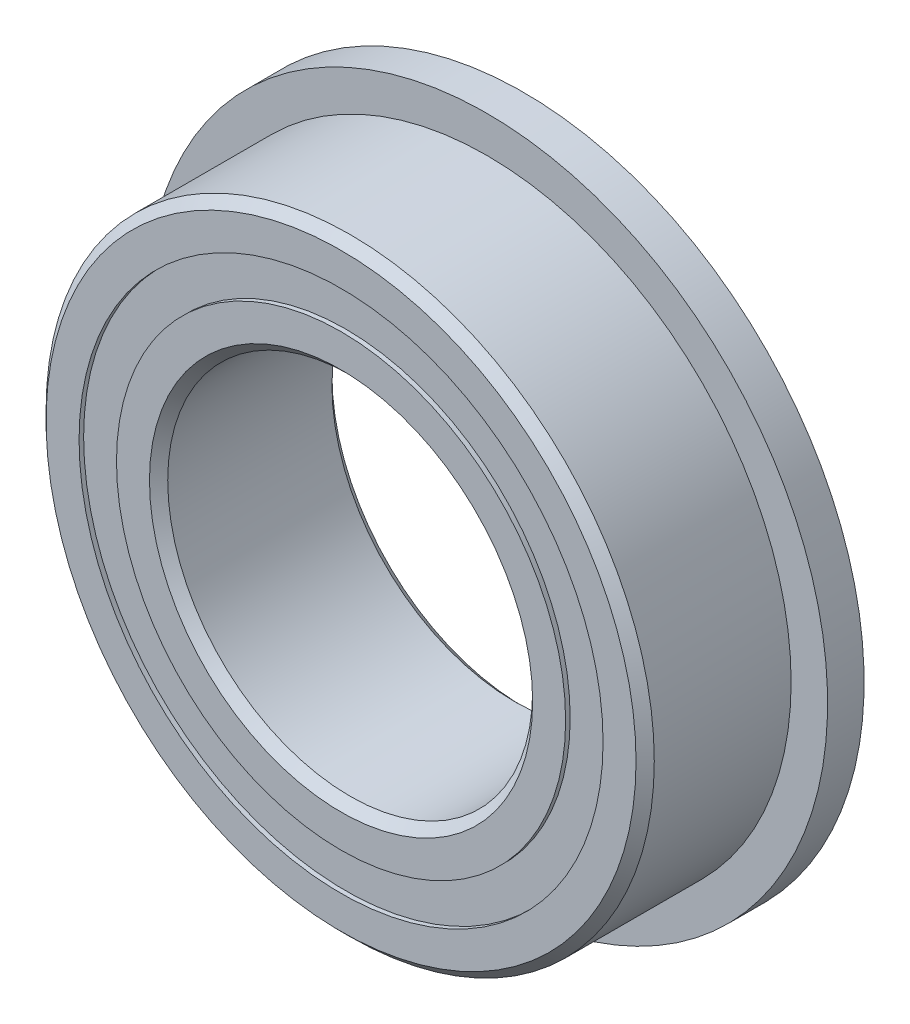
ISO-10303-21;
HEADER;
FILE_DESCRIPTION(('STEP AP214'),'2;1');
FILE_NAME('part.step','',(''),(''),'','','');
FILE_SCHEMA(('AUTOMOTIVE_DESIGN { 1 0 10303 214 1 1 1 1 }'));
ENDSEC;
DATA;
#1=APPLICATION_CONTEXT('core data for automotive mechanical design processes');
#2=APPLICATION_PROTOCOL_DEFINITION('international standard','automotive_design',2000,#1);
#3=PRODUCT_CONTEXT('',#1,'mechanical');
#4=PRODUCT('Part','Part','',(#3));
#5=PRODUCT_RELATED_PRODUCT_CATEGORY('part','',(#4));
#6=PRODUCT_DEFINITION_FORMATION('','',#4);
#7=PRODUCT_DEFINITION_CONTEXT('part definition',#1,'design');
#8=PRODUCT_DEFINITION('design','',#6,#7);
#9=PRODUCT_DEFINITION_SHAPE('','',#8);
#10=(LENGTH_UNIT() NAMED_UNIT(*) SI_UNIT(.MILLI.,.METRE.));
#11=(NAMED_UNIT(*) PLANE_ANGLE_UNIT() SI_UNIT($,.RADIAN.));
#12=(NAMED_UNIT(*) SI_UNIT($,.STERADIAN.) SOLID_ANGLE_UNIT());
#13=UNCERTAINTY_MEASURE_WITH_UNIT(LENGTH_MEASURE(1.E-05),#10,'distance_accuracy_value','');
#14=(GEOMETRIC_REPRESENTATION_CONTEXT(3) GLOBAL_UNCERTAINTY_ASSIGNED_CONTEXT((#13)) GLOBAL_UNIT_ASSIGNED_CONTEXT((#10,
#11,#12)) REPRESENTATION_CONTEXT('',''));
#15=CARTESIAN_POINT('',(0.,0.,0.));
#16=DIRECTION('',(0.,0.,1.));
#17=DIRECTION('',(1.,0.,0.));
#18=AXIS2_PLACEMENT_3D('',#15,#16,#17);
#19=CARTESIAN_POINT('',(0.,4.30769230769231,-1.425));
#20=DIRECTION('',(0.,0.,1.));
#21=DIRECTION('',(1.,0.,0.));
#22=AXIS2_PLACEMENT_3D('',#19,#20,#21);
#23=PLANE('',#22);
#24=CARTESIAN_POINT('',(0.,0.,-1.425));
#25=DIRECTION('',(0.,0.,1.));
#26=DIRECTION('',(1.,0.,0.));
#27=AXIS2_PLACEMENT_3D('',#24,#25,#26);
#28=CIRCLE('',#27,4.30769230769231);
#29=CARTESIAN_POINT('',(4.30769230769231,0.,-1.425));
#30=VERTEX_POINT('',#29);
#31=EDGE_CURVE('E58',#30,#30,#28,.T.);
#32=ORIENTED_EDGE('',*,*,#31,.F.);
#33=EDGE_LOOP('',(#32));
#34=FACE_BOUND('',#33,.T.);
#35=CARTESIAN_POINT('',(0.,0.,-1.425));
#36=DIRECTION('',(0.,0.,1.));
#37=DIRECTION('',(1.,0.,0.));
#38=AXIS2_PLACEMENT_3D('',#35,#36,#37);
#39=CIRCLE('',#38,3.69230769230769);
#40=CARTESIAN_POINT('',(3.69230769230769,0.,-1.425));
#41=VERTEX_POINT('',#40);
#42=EDGE_CURVE('E11',#41,#41,#39,.T.);
#43=ORIENTED_EDGE('',*,*,#42,.T.);
#44=EDGE_LOOP('',(#43));
#45=FACE_BOUND('',#44,.T.);
#46=ADVANCED_FACE('F44',(#34,#45),#23,.F.);
#47=CARTESIAN_POINT('',(0.,0.,1.5));
#48=DIRECTION('',(0.,0.,1.));
#49=DIRECTION('',(1.,0.,0.));
#50=AXIS2_PLACEMENT_3D('',#47,#48,#49);
#51=CYLINDRICAL_SURFACE('',#50,3.69230769230769);
#52=ORIENTED_EDGE('',*,*,#42,.F.);
#53=EDGE_LOOP('',(#52));
#54=FACE_BOUND('',#53,.T.);
#55=CARTESIAN_POINT('',(0.,0.,-0.734247234014173));
#56=DIRECTION('',(0.,0.,1.));
#57=DIRECTION('',(1.,0.,0.));
#58=AXIS2_PLACEMENT_3D('',#55,#56,#57);
#59=CIRCLE('',#58,3.69230769230769);
#60=CARTESIAN_POINT('',(3.69230769230769,0.,-0.734247234014173));
#61=VERTEX_POINT('',#60);
#62=EDGE_CURVE('E50',#61,#61,#59,.T.);
#63=ORIENTED_EDGE('',*,*,#62,.T.);
#64=EDGE_LOOP('',(#63));
#65=FACE_BOUND('',#64,.T.);
#66=ADVANCED_FACE('F67',(#54,#65),#51,.F.);
#67=CARTESIAN_POINT('',(0.,4.30769230769231,-0.734247234014172));
#68=DIRECTION('',(0.,0.,-1.));
#69=DIRECTION('',(-1.,0.,0.));
#70=AXIS2_PLACEMENT_3D('',#67,#68,#69);
#71=PLANE('',#70);
#72=ORIENTED_EDGE('',*,*,#62,.F.);
#73=EDGE_LOOP('',(#72));
#74=FACE_BOUND('',#73,.T.);
#75=CARTESIAN_POINT('',(0.,0.,-0.734247234014172));
#76=DIRECTION('',(0.,0.,1.));
#77=DIRECTION('',(1.,0.,0.));
#78=AXIS2_PLACEMENT_3D('',#75,#76,#77);
#79=CIRCLE('',#78,4.30769230769231);
#80=CARTESIAN_POINT('',(4.30769230769231,0.,-0.734247234014172));
#81=VERTEX_POINT('',#80);
#82=EDGE_CURVE('E54',#81,#81,#79,.T.);
#83=ORIENTED_EDGE('',*,*,#82,.T.);
#84=EDGE_LOOP('',(#83));
#85=FACE_BOUND('',#84,.T.);
#86=ADVANCED_FACE('F71',(#74,#85),#71,.F.);
#87=CARTESIAN_POINT('',(0.,0.,1.5));
#88=DIRECTION('',(0.,0.,1.));
#89=DIRECTION('',(1.,0.,0.));
#90=AXIS2_PLACEMENT_3D('',#87,#88,#89);
#91=CYLINDRICAL_SURFACE('',#90,4.30769230769231);
#92=ORIENTED_EDGE('',*,*,#82,.F.);
#93=EDGE_LOOP('',(#92));
#94=FACE_BOUND('',#93,.T.);
#95=ORIENTED_EDGE('',*,*,#31,.T.);
#96=EDGE_LOOP('',(#95));
#97=FACE_BOUND('',#96,.T.);
#98=ADVANCED_FACE('F64',(#94,#97),#91,.T.);
#99=CLOSED_SHELL('',(#46,#66,#86,#98));
#100=MANIFOLD_SOLID_BREP('B2',#99);
#101=CARTESIAN_POINT('',(0.,4.30769230769231,1.425));
#102=DIRECTION('',(0.,0.,-1.));
#103=DIRECTION('',(-1.,0.,0.));
#104=AXIS2_PLACEMENT_3D('',#101,#102,#103);
#105=PLANE('',#104);
#106=CARTESIAN_POINT('',(0.,0.,1.425));
#107=DIRECTION('',(0.,0.,1.));
#108=DIRECTION('',(1.,0.,0.));
#109=AXIS2_PLACEMENT_3D('',#106,#107,#108);
#110=CIRCLE('',#109,3.69230769230769);
#111=CARTESIAN_POINT('',(3.69230769230769,0.,1.425));
#112=VERTEX_POINT('',#111);
#113=EDGE_CURVE('E43',#112,#112,#110,.T.);
#114=ORIENTED_EDGE('',*,*,#113,.F.);
#115=EDGE_LOOP('',(#114));
#116=FACE_BOUND('',#115,.T.);
#117=CARTESIAN_POINT('',(0.,0.,1.425));
#118=DIRECTION('',(0.,0.,1.));
#119=DIRECTION('',(1.,0.,0.));
#120=AXIS2_PLACEMENT_3D('',#117,#118,#119);
#121=CIRCLE('',#120,4.30769230769231);
#122=CARTESIAN_POINT('',(4.30769230769231,0.,1.425));
#123=VERTEX_POINT('',#122);
#124=EDGE_CURVE('E126',#123,#123,#121,.T.);
#125=ORIENTED_EDGE('',*,*,#124,.T.);
#126=EDGE_LOOP('',(#125));
#127=FACE_BOUND('',#126,.T.);
#128=ADVANCED_FACE('F112',(#116,#127),#105,.F.);
#129=CARTESIAN_POINT('',(0.,0.,1.5));
#130=DIRECTION('',(0.,0.,1.));
#131=DIRECTION('',(1.,0.,0.));
#132=AXIS2_PLACEMENT_3D('',#129,#130,#131);
#133=CYLINDRICAL_SURFACE('',#132,3.69230769230769);
#134=CARTESIAN_POINT('',(0.,0.,0.734247234014171));
#135=DIRECTION('',(0.,0.,1.));
#136=DIRECTION('',(1.,0.,0.));
#137=AXIS2_PLACEMENT_3D('',#134,#135,#136);
#138=CIRCLE('',#137,3.69230769230769);
#139=CARTESIAN_POINT('',(3.69230769230769,0.,0.734247234014171));
#140=VERTEX_POINT('',#139);
#141=EDGE_CURVE('E118',#140,#140,#138,.T.);
#142=ORIENTED_EDGE('',*,*,#141,.F.);
#143=EDGE_LOOP('',(#142));
#144=FACE_BOUND('',#143,.T.);
#145=ORIENTED_EDGE('',*,*,#113,.T.);
#146=EDGE_LOOP('',(#145));
#147=FACE_BOUND('',#146,.T.);
#148=ADVANCED_FACE('F141',(#144,#147),#133,.F.);
#149=CARTESIAN_POINT('',(0.,4.30769230769231,0.734247234014171));
#150=DIRECTION('',(0.,0.,1.));
#151=DIRECTION('',(1.,0.,0.));
#152=AXIS2_PLACEMENT_3D('',#149,#150,#151);
#153=PLANE('',#152);
#154=CARTESIAN_POINT('',(0.,0.,0.734247234014171));
#155=DIRECTION('',(0.,0.,1.));
#156=DIRECTION('',(1.,0.,0.));
#157=AXIS2_PLACEMENT_3D('',#154,#155,#156);
#158=CIRCLE('',#157,4.30769230769231);
#159=CARTESIAN_POINT('',(4.30769230769231,0.,0.734247234014171));
#160=VERTEX_POINT('',#159);
#161=EDGE_CURVE('E122',#160,#160,#158,.T.);
#162=ORIENTED_EDGE('',*,*,#161,.F.);
#163=EDGE_LOOP('',(#162));
#164=FACE_BOUND('',#163,.T.);
#165=ORIENTED_EDGE('',*,*,#141,.T.);
#166=EDGE_LOOP('',(#165));
#167=FACE_BOUND('',#166,.T.);
#168=ADVANCED_FACE('F136',(#164,#167),#153,.F.);
#169=CARTESIAN_POINT('',(0.,0.,1.5));
#170=DIRECTION('',(0.,0.,1.));
#171=DIRECTION('',(1.,0.,0.));
#172=AXIS2_PLACEMENT_3D('',#169,#170,#171);
#173=CYLINDRICAL_SURFACE('',#172,4.30769230769231);
#174=ORIENTED_EDGE('',*,*,#124,.F.);
#175=EDGE_LOOP('',(#174));
#176=FACE_BOUND('',#175,.T.);
#177=ORIENTED_EDGE('',*,*,#161,.T.);
#178=EDGE_LOOP('',(#177));
#179=FACE_BOUND('',#178,.T.);
#180=ADVANCED_FACE('F133',(#176,#179),#173,.T.);
#181=CLOSED_SHELL('',(#128,#148,#168,#180));
#182=MANIFOLD_SOLID_BREP('B6',#181);
#183=CARTESIAN_POINT('',(-1.99999999999996,3.46410161513778,0.));
#184=DIRECTION('',(0.,0.,1.));
#185=DIRECTION('',(-0.499999999999989,0.866025403784445,0.));
#186=AXIS2_PLACEMENT_3D('',#183,#184,#185);
#187=SPHERICAL_SURFACE('',#186,0.734247234014172);
#188=CARTESIAN_POINT('',(-1.99999999999996,3.46410161513778,0.734247234014171));
#189=VERTEX_POINT('',#188);
#190=VERTEX_LOOP('',#189);
#191=FACE_BOUND('',#190,.T.);
#192=ADVANCED_FACE('F180',(#191),#187,.T.);
#193=CLOSED_SHELL('',(#192));
#194=MANIFOLD_SOLID_BREP('B38',#193);
#195=CARTESIAN_POINT('',(-3.46410161513773,2.00000000000004,0.));
#196=DIRECTION('',(0.,0.,1.));
#197=DIRECTION('',(-0.866025403784433,0.50000000000001,0.));
#198=AXIS2_PLACEMENT_3D('',#195,#196,#197);
#199=SPHERICAL_SURFACE('',#198,0.734247234014172);
#200=CARTESIAN_POINT('',(-3.46410161513773,2.00000000000004,0.734247234014171));
#201=VERTEX_POINT('',#200);
#202=VERTEX_LOOP('',#201);
#203=FACE_BOUND('',#202,.T.);
#204=ADVANCED_FACE('F201',(#203),#199,.T.);
#205=CLOSED_SHELL('',(#204));
#206=MANIFOLD_SOLID_BREP('B108',#205);
#207=CARTESIAN_POINT('',(-4.,0.,0.));
#208=DIRECTION('',(0.,0.,1.));
#209=DIRECTION('',(-1.,0.,0.));
#210=AXIS2_PLACEMENT_3D('',#207,#208,#209);
#211=SPHERICAL_SURFACE('',#210,0.734247234014172);
#212=CARTESIAN_POINT('',(-4.,0.,0.734247234014171));
#213=VERTEX_POINT('',#212);
#214=VERTEX_LOOP('',#213);
#215=FACE_BOUND('',#214,.T.);
#216=ADVANCED_FACE('F222',(#215),#211,.T.);
#217=CLOSED_SHELL('',(#216));
#218=MANIFOLD_SOLID_BREP('B176',#217);
#219=CARTESIAN_POINT('',(-3.46410161513777,-1.99999999999997,0.));
#220=DIRECTION('',(0.,0.,1.));
#221=DIRECTION('',(-0.866025403784443,-0.499999999999992,0.));
#222=AXIS2_PLACEMENT_3D('',#219,#220,#221);
#223=SPHERICAL_SURFACE('',#222,0.734247234014172);
#224=CARTESIAN_POINT('',(-3.46410161513777,-1.99999999999997,0.734247234014171));
#225=VERTEX_POINT('',#224);
#226=VERTEX_LOOP('',#225);
#227=FACE_BOUND('',#226,.T.);
#228=ADVANCED_FACE('F243',(#227),#223,.T.);
#229=CLOSED_SHELL('',(#228));
#230=MANIFOLD_SOLID_BREP('B197',#229);
#231=CARTESIAN_POINT('',(-2.00000000000003,-3.46410161513774,0.));
#232=DIRECTION('',(0.,0.,1.));
#233=DIRECTION('',(-0.500000000000007,-0.866025403784435,0.));
#234=AXIS2_PLACEMENT_3D('',#231,#232,#233);
#235=SPHERICAL_SURFACE('',#234,0.734247234014172);
#236=CARTESIAN_POINT('',(-2.00000000000003,-3.46410161513774,0.734247234014171));
#237=VERTEX_POINT('',#236);
#238=VERTEX_LOOP('',#237);
#239=FACE_BOUND('',#238,.T.);
#240=ADVANCED_FACE('F264',(#239),#235,.T.);
#241=CLOSED_SHELL('',(#240));
#242=MANIFOLD_SOLID_BREP('B218',#241);
#243=CARTESIAN_POINT('',(0.,-4.,0.));
#244=DIRECTION('',(0.,0.,1.));
#245=DIRECTION('',(0.,-1.,0.));
#246=AXIS2_PLACEMENT_3D('',#243,#244,#245);
#247=SPHERICAL_SURFACE('',#246,0.734247234014172);
#248=CARTESIAN_POINT('',(0.,-4.,0.734247234014171));
#249=VERTEX_POINT('',#248);
#250=VERTEX_LOOP('',#249);
#251=FACE_BOUND('',#250,.T.);
#252=ADVANCED_FACE('F285',(#251),#247,.T.);
#253=CLOSED_SHELL('',(#252));
#254=MANIFOLD_SOLID_BREP('B239',#253);
#255=CARTESIAN_POINT('',(1.99999999999998,-3.46410161513777,0.));
#256=DIRECTION('',(0.,0.,1.));
#257=DIRECTION('',(0.499999999999995,-0.866025403784442,0.));
#258=AXIS2_PLACEMENT_3D('',#255,#256,#257);
#259=SPHERICAL_SURFACE('',#258,0.734247234014172);
#260=CARTESIAN_POINT('',(1.99999999999998,-3.46410161513777,0.734247234014171));
#261=VERTEX_POINT('',#260);
#262=VERTEX_LOOP('',#261);
#263=FACE_BOUND('',#262,.T.);
#264=ADVANCED_FACE('F306',(#263),#259,.T.);
#265=CLOSED_SHELL('',(#264));
#266=MANIFOLD_SOLID_BREP('B260',#265);
#267=CARTESIAN_POINT('',(3.46410161513775,-2.00000000000002,0.));
#268=DIRECTION('',(0.,0.,1.));
#269=DIRECTION('',(0.866025403784436,-0.500000000000004,0.));
#270=AXIS2_PLACEMENT_3D('',#267,#268,#269);
#271=SPHERICAL_SURFACE('',#270,0.734247234014172);
#272=CARTESIAN_POINT('',(3.46410161513775,-2.00000000000002,0.734247234014171));
#273=VERTEX_POINT('',#272);
#274=VERTEX_LOOP('',#273);
#275=FACE_BOUND('',#274,.T.);
#276=ADVANCED_FACE('F327',(#275),#271,.T.);
#277=CLOSED_SHELL('',(#276));
#278=MANIFOLD_SOLID_BREP('B281',#277);
#279=CARTESIAN_POINT('',(4.,0.,0.));
#280=DIRECTION('',(0.,0.,1.));
#281=DIRECTION('',(1.,0.,0.));
#282=AXIS2_PLACEMENT_3D('',#279,#280,#281);
#283=SPHERICAL_SURFACE('',#282,0.734247234014172);
#284=CARTESIAN_POINT('',(4.,0.,0.734247234014171));
#285=VERTEX_POINT('',#284);
#286=VERTEX_LOOP('',#285);
#287=FACE_BOUND('',#286,.T.);
#288=ADVANCED_FACE('F348',(#287),#283,.T.);
#289=CLOSED_SHELL('',(#288));
#290=MANIFOLD_SOLID_BREP('B302',#289);
#291=CARTESIAN_POINT('',(3.46410161513776,1.99999999999999,0.));
#292=DIRECTION('',(0.,0.,1.));
#293=DIRECTION('',(0.86602540378444,0.499999999999998,0.));
#294=AXIS2_PLACEMENT_3D('',#291,#292,#293);
#295=SPHERICAL_SURFACE('',#294,0.734247234014172);
#296=CARTESIAN_POINT('',(3.46410161513776,1.99999999999999,0.734247234014171));
#297=VERTEX_POINT('',#296);
#298=VERTEX_LOOP('',#297);
#299=FACE_BOUND('',#298,.T.);
#300=ADVANCED_FACE('F369',(#299),#295,.T.);
#301=CLOSED_SHELL('',(#300));
#302=MANIFOLD_SOLID_BREP('B323',#301);
#303=CARTESIAN_POINT('',(2.,3.46410161513775,0.));
#304=DIRECTION('',(0.,0.,1.));
#305=DIRECTION('',(0.500000000000001,0.866025403784438,0.));
#306=AXIS2_PLACEMENT_3D('',#303,#304,#305);
#307=SPHERICAL_SURFACE('',#306,0.734247234014172);
#308=CARTESIAN_POINT('',(2.,3.46410161513775,0.734247234014171));
#309=VERTEX_POINT('',#308);
#310=VERTEX_LOOP('',#309);
#311=FACE_BOUND('',#310,.T.);
#312=ADVANCED_FACE('F390',(#311),#307,.T.);
#313=CLOSED_SHELL('',(#312));
#314=MANIFOLD_SOLID_BREP('B344',#313);
#315=CARTESIAN_POINT('',(0.,4.,0.));
#316=DIRECTION('',(0.,0.,1.));
#317=DIRECTION('',(0.,1.,0.));
#318=AXIS2_PLACEMENT_3D('',#315,#316,#317);
#319=SPHERICAL_SURFACE('',#318,0.734247234014172);
#320=CARTESIAN_POINT('',(0.,4.,0.734247234014171));
#321=VERTEX_POINT('',#320);
#322=VERTEX_LOOP('',#321);
#323=FACE_BOUND('',#322,.T.);
#324=ADVANCED_FACE('F413',(#323),#319,.T.);
#325=CLOSED_SHELL('',(#324));
#326=MANIFOLD_SOLID_BREP('B365',#325);
#327=CARTESIAN_POINT('',(0.,3.69230769230769,1.5));
#328=DIRECTION('',(0.,0.,-1.));
#329=DIRECTION('',(-1.,0.,0.));
#330=AXIS2_PLACEMENT_3D('',#327,#328,#329);
#331=PLANE('',#330);
#332=CARTESIAN_POINT('',(0.,0.,1.5));
#333=DIRECTION('',(0.,0.,1.));
#334=DIRECTION('',(1.,0.,0.));
#335=AXIS2_PLACEMENT_3D('',#332,#333,#334);
#336=CIRCLE('',#335,3.15);
#337=CARTESIAN_POINT('',(3.15,0.,1.5));
#338=VERTEX_POINT('',#337);
#339=EDGE_CURVE('E461',#338,#338,#336,.T.);
#340=ORIENTED_EDGE('',*,*,#339,.F.);
#341=EDGE_LOOP('',(#340));
#342=FACE_BOUND('',#341,.T.);
#343=CARTESIAN_POINT('',(0.,0.,1.5));
#344=DIRECTION('',(0.,0.,1.));
#345=DIRECTION('',(1.,0.,0.));
#346=AXIS2_PLACEMENT_3D('',#343,#344,#345);
#347=CIRCLE('',#346,3.69230769230769);
#348=CARTESIAN_POINT('',(3.69230769230769,0.,1.5));
#349=VERTEX_POINT('',#348);
#350=EDGE_CURVE('E412',#349,#349,#347,.T.);
#351=ORIENTED_EDGE('',*,*,#350,.T.);
#352=EDGE_LOOP('',(#351));
#353=FACE_BOUND('',#352,.T.);
#354=ADVANCED_FACE('F433',(#342,#353),#331,.F.);
#355=CARTESIAN_POINT('',(0.,0.,1.5));
#356=DIRECTION('',(0.,0.,1.));
#357=DIRECTION('',(1.,0.,0.));
#358=AXIS2_PLACEMENT_3D('',#355,#356,#357);
#359=CYLINDRICAL_SURFACE('',#358,3.69230769230769);
#360=ORIENTED_EDGE('',*,*,#350,.F.);
#361=EDGE_LOOP('',(#360));
#362=FACE_BOUND('',#361,.T.);
#363=CARTESIAN_POINT('',(0.,0.,0.666666666666666));
#364=DIRECTION('',(0.,0.,1.));
#365=DIRECTION('',(1.,0.,0.));
#366=AXIS2_PLACEMENT_3D('',#363,#364,#365);
#367=CIRCLE('',#366,3.69230769230769);
#368=CARTESIAN_POINT('',(3.69230769230769,0.,0.666666666666666));
#369=VERTEX_POINT('',#368);
#370=EDGE_CURVE('E439',#369,#369,#367,.T.);
#371=ORIENTED_EDGE('',*,*,#370,.T.);
#372=EDGE_LOOP('',(#371));
#373=FACE_BOUND('',#372,.T.);
#374=ADVANCED_FACE('F468',(#362,#373),#359,.T.);
#375=CARTESIAN_POINT('',(0.,0.,0.));
#376=DIRECTION('',(0.,0.,1.));
#377=DIRECTION('',(1.,0.,0.));
#378=AXIS2_PLACEMENT_3D('',#375,#376,#377);
#379=TOROIDAL_SURFACE('',#378,3.99999999999999,0.73424723401417);
#380=ORIENTED_EDGE('',*,*,#370,.F.);
#381=EDGE_LOOP('',(#380));
#382=FACE_BOUND('',#381,.T.);
#383=CARTESIAN_POINT('',(0.,0.,-0.666666666666668));
#384=DIRECTION('',(0.,0.,1.));
#385=DIRECTION('',(1.,0.,0.));
#386=AXIS2_PLACEMENT_3D('',#383,#384,#385);
#387=CIRCLE('',#386,3.69230769230769);
#388=CARTESIAN_POINT('',(3.69230769230769,0.,-0.666666666666668));
#389=VERTEX_POINT('',#388);
#390=EDGE_CURVE('E443',#389,#389,#387,.T.);
#391=ORIENTED_EDGE('',*,*,#390,.T.);
#392=EDGE_LOOP('',(#391));
#393=FACE_BOUND('',#392,.T.);
#394=ADVANCED_FACE('F472',(#382,#393),#379,.F.);
#395=CARTESIAN_POINT('',(0.,0.,1.5));
#396=DIRECTION('',(0.,0.,1.));
#397=DIRECTION('',(1.,0.,0.));
#398=AXIS2_PLACEMENT_3D('',#395,#396,#397);
#399=CYLINDRICAL_SURFACE('',#398,3.69230769230769);
#400=ORIENTED_EDGE('',*,*,#390,.F.);
#401=EDGE_LOOP('',(#400));
#402=FACE_BOUND('',#401,.T.);
#403=CARTESIAN_POINT('',(0.,0.,-1.5));
#404=DIRECTION('',(0.,0.,1.));
#405=DIRECTION('',(1.,0.,0.));
#406=AXIS2_PLACEMENT_3D('',#403,#404,#405);
#407=CIRCLE('',#406,3.69230769230769);
#408=CARTESIAN_POINT('',(3.69230769230769,0.,-1.5));
#409=VERTEX_POINT('',#408);
#410=EDGE_CURVE('E447',#409,#409,#407,.T.);
#411=ORIENTED_EDGE('',*,*,#410,.T.);
#412=EDGE_LOOP('',(#411));
#413=FACE_BOUND('',#412,.T.);
#414=ADVANCED_FACE('F477',(#402,#413),#399,.T.);
#415=CARTESIAN_POINT('',(0.,3.15,-1.5));
#416=DIRECTION('',(0.,0.,1.));
#417=DIRECTION('',(1.,0.,0.));
#418=AXIS2_PLACEMENT_3D('',#415,#416,#417);
#419=PLANE('',#418);
#420=ORIENTED_EDGE('',*,*,#410,.F.);
#421=EDGE_LOOP('',(#420));
#422=FACE_BOUND('',#421,.T.);
#423=CARTESIAN_POINT('',(0.,0.,-1.5));
#424=DIRECTION('',(0.,0.,1.));
#425=DIRECTION('',(1.,0.,0.));
#426=AXIS2_PLACEMENT_3D('',#423,#424,#425);
#427=CIRCLE('',#426,3.15);
#428=CARTESIAN_POINT('',(3.15,0.,-1.5));
#429=VERTEX_POINT('',#428);
#430=EDGE_CURVE('E452',#429,#429,#427,.T.);
#431=ORIENTED_EDGE('',*,*,#430,.T.);
#432=EDGE_LOOP('',(#431));
#433=FACE_BOUND('',#432,.T.);
#434=ADVANCED_FACE('F483',(#422,#433),#419,.F.);
#435=CARTESIAN_POINT('',(0.,0.,-1.35));
#436=DIRECTION('',(0.,0.,-1.));
#437=DIRECTION('',(-1.,0.,0.));
#438=AXIS2_PLACEMENT_3D('',#435,#436,#437);
#439=CONICAL_SURFACE('',#438,3.,0.785398163397448);
#440=ORIENTED_EDGE('',*,*,#430,.F.);
#441=EDGE_LOOP('',(#440));
#442=FACE_BOUND('',#441,.T.);
#443=CARTESIAN_POINT('',(0.,0.,-1.35));
#444=DIRECTION('',(0.,0.,1.));
#445=DIRECTION('',(1.,0.,0.));
#446=AXIS2_PLACEMENT_3D('',#443,#444,#445);
#447=CIRCLE('',#446,3.);
#448=CARTESIAN_POINT('',(3.,0.,-1.35));
#449=VERTEX_POINT('',#448);
#450=EDGE_CURVE('E455',#449,#449,#447,.T.);
#451=ORIENTED_EDGE('',*,*,#450,.T.);
#452=EDGE_LOOP('',(#451));
#453=FACE_BOUND('',#452,.T.);
#454=ADVANCED_FACE('F487',(#442,#453),#439,.F.);
#455=CARTESIAN_POINT('',(0.,0.,1.5));
#456=DIRECTION('',(0.,0.,1.));
#457=DIRECTION('',(1.,0.,0.));
#458=AXIS2_PLACEMENT_3D('',#455,#456,#457);
#459=CYLINDRICAL_SURFACE('',#458,3.);
#460=ORIENTED_EDGE('',*,*,#450,.F.);
#461=EDGE_LOOP('',(#460));
#462=FACE_BOUND('',#461,.T.);
#463=CARTESIAN_POINT('',(0.,0.,1.35));
#464=DIRECTION('',(0.,0.,1.));
#465=DIRECTION('',(1.,0.,0.));
#466=AXIS2_PLACEMENT_3D('',#463,#464,#465);
#467=CIRCLE('',#466,3.);
#468=CARTESIAN_POINT('',(3.,0.,1.35));
#469=VERTEX_POINT('',#468);
#470=EDGE_CURVE('E458',#469,#469,#467,.T.);
#471=ORIENTED_EDGE('',*,*,#470,.T.);
#472=EDGE_LOOP('',(#471));
#473=FACE_BOUND('',#472,.T.);
#474=ADVANCED_FACE('F491',(#462,#473),#459,.F.);
#475=CARTESIAN_POINT('',(0.,0.,1.5));
#476=DIRECTION('',(0.,0.,1.));
#477=DIRECTION('',(1.,0.,0.));
#478=AXIS2_PLACEMENT_3D('',#475,#476,#477);
#479=CONICAL_SURFACE('',#478,3.15,0.785398163397443);
#480=ORIENTED_EDGE('',*,*,#470,.F.);
#481=EDGE_LOOP('',(#480));
#482=FACE_BOUND('',#481,.T.);
#483=ORIENTED_EDGE('',*,*,#339,.T.);
#484=EDGE_LOOP('',(#483));
#485=FACE_BOUND('',#484,.T.);
#486=ADVANCED_FACE('F465',(#482,#485),#479,.F.);
#487=CLOSED_SHELL('',(#354,#374,#394,#414,#434,#454,#474,#486));
#488=MANIFOLD_SOLID_BREP('B386',#487);
#489=CARTESIAN_POINT('',(0.,0.,1.35));
#490=DIRECTION('',(0.,0.,-1.));
#491=DIRECTION('',(-1.,0.,0.));
#492=AXIS2_PLACEMENT_3D('',#489,#490,#491);
#493=CONICAL_SURFACE('',#492,5.,0.785398163397451);
#494=CARTESIAN_POINT('',(0.,0.,1.5));
#495=DIRECTION('',(0.,0.,1.));
#496=DIRECTION('',(1.,0.,0.));
#497=AXIS2_PLACEMENT_3D('',#494,#495,#496);
#498=CIRCLE('',#497,4.85);
#499=CARTESIAN_POINT('',(4.85,0.,1.5));
#500=VERTEX_POINT('',#499);
#501=EDGE_CURVE('E577',#500,#500,#498,.T.);
#502=ORIENTED_EDGE('',*,*,#501,.F.);
#503=EDGE_LOOP('',(#502));
#504=FACE_BOUND('',#503,.T.);
#505=CARTESIAN_POINT('',(0.,0.,1.35));
#506=DIRECTION('',(0.,0.,1.));
#507=DIRECTION('',(1.,0.,0.));
#508=AXIS2_PLACEMENT_3D('',#505,#506,#507);
#509=CIRCLE('',#508,5.);
#510=CARTESIAN_POINT('',(5.,0.,1.35));
#511=VERTEX_POINT('',#510);
#512=EDGE_CURVE('E432',#511,#511,#509,.T.);
#513=ORIENTED_EDGE('',*,*,#512,.T.);
#514=EDGE_LOOP('',(#513));
#515=FACE_BOUND('',#514,.T.);
#516=ADVANCED_FACE('F555',(#504,#515),#493,.T.);
#517=CARTESIAN_POINT('',(0.,0.,1.5));
#518=DIRECTION('',(0.,0.,1.));
#519=DIRECTION('',(1.,0.,0.));
#520=AXIS2_PLACEMENT_3D('',#517,#518,#519);
#521=CYLINDRICAL_SURFACE('',#520,5.);
#522=CARTESIAN_POINT('',(0.,0.,-0.9));
#523=DIRECTION('',(0.,0.,1.));
#524=DIRECTION('',(1.,0.,0.));
#525=AXIS2_PLACEMENT_3D('',#522,#523,#524);
#526=CIRCLE('',#525,5.);
#527=CARTESIAN_POINT('',(5.,0.,-0.9));
#528=VERTEX_POINT('',#527);
#529=EDGE_CURVE('E580',#528,#528,#526,.T.);
#530=ORIENTED_EDGE('',*,*,#529,.T.);
#531=EDGE_LOOP('',(#530));
#532=FACE_BOUND('',#531,.T.);
#533=ORIENTED_EDGE('',*,*,#512,.F.);
#534=EDGE_LOOP('',(#533));
#535=FACE_BOUND('',#534,.T.);
#536=ADVANCED_FACE('F600',(#532,#535),#521,.T.);
#537=CARTESIAN_POINT('',(0.,4.85,-1.5));
#538=DIRECTION('',(0.,0.,1.));
#539=DIRECTION('',(1.,0.,0.));
#540=AXIS2_PLACEMENT_3D('',#537,#538,#539);
#541=PLANE('',#540);
#542=CARTESIAN_POINT('',(0.,0.,-1.5));
#543=DIRECTION('',(0.,0.,1.));
#544=DIRECTION('',(1.,0.,0.));
#545=AXIS2_PLACEMENT_3D('',#542,#543,#544);
#546=CIRCLE('',#545,4.30769230769231);
#547=CARTESIAN_POINT('',(4.30769230769231,0.,-1.5));
#548=VERTEX_POINT('',#547);
#549=EDGE_CURVE('E561',#548,#548,#546,.T.);
#550=ORIENTED_EDGE('',*,*,#549,.T.);
#551=EDGE_LOOP('',(#550));
#552=FACE_BOUND('',#551,.T.);
#553=CARTESIAN_POINT('',(0.,0.,-1.5));
#554=DIRECTION('',(0.,0.,-1.));
#555=DIRECTION('',(-1.,0.,0.));
#556=AXIS2_PLACEMENT_3D('',#553,#554,#555);
#557=CIRCLE('',#556,5.6);
#558=CARTESIAN_POINT('',(-5.6,0.,-1.5));
#559=VERTEX_POINT('',#558);
#560=EDGE_CURVE('E583',#559,#559,#557,.T.);
#561=ORIENTED_EDGE('',*,*,#560,.T.);
#562=EDGE_LOOP('',(#561));
#563=FACE_BOUND('',#562,.T.);
#564=ADVANCED_FACE('F603',(#552,#563),#541,.F.);
#565=CARTESIAN_POINT('',(0.,0.,1.5));
#566=DIRECTION('',(0.,0.,1.));
#567=DIRECTION('',(1.,0.,0.));
#568=AXIS2_PLACEMENT_3D('',#565,#566,#567);
#569=CYLINDRICAL_SURFACE('',#568,4.30769230769231);
#570=CARTESIAN_POINT('',(0.,0.,-0.666666666666667));
#571=DIRECTION('',(0.,0.,1.));
#572=DIRECTION('',(1.,0.,0.));
#573=AXIS2_PLACEMENT_3D('',#570,#571,#572);
#574=CIRCLE('',#573,4.30769230769231);
#575=CARTESIAN_POINT('',(4.30769230769231,0.,-0.666666666666667));
#576=VERTEX_POINT('',#575);
#577=EDGE_CURVE('E565',#576,#576,#574,.T.);
#578=ORIENTED_EDGE('',*,*,#577,.T.);
#579=EDGE_LOOP('',(#578));
#580=FACE_BOUND('',#579,.T.);
#581=ORIENTED_EDGE('',*,*,#549,.F.);
#582=EDGE_LOOP('',(#581));
#583=FACE_BOUND('',#582,.T.);
#584=ADVANCED_FACE('F608',(#580,#583),#569,.F.);
#585=CARTESIAN_POINT('',(0.,0.,0.));
#586=DIRECTION('',(0.,0.,1.));
#587=DIRECTION('',(1.,0.,0.));
#588=AXIS2_PLACEMENT_3D('',#585,#586,#587);
#589=TOROIDAL_SURFACE('',#588,4.,0.734247234014172);
#590=ORIENTED_EDGE('',*,*,#577,.F.);
#591=EDGE_LOOP('',(#590));
#592=FACE_BOUND('',#591,.T.);
#593=CARTESIAN_POINT('',(0.,0.,0.666666666666666));
#594=DIRECTION('',(0.,0.,1.));
#595=DIRECTION('',(1.,0.,0.));
#596=AXIS2_PLACEMENT_3D('',#593,#594,#595);
#597=CIRCLE('',#596,4.30769230769231);
#598=CARTESIAN_POINT('',(4.30769230769231,0.,0.666666666666666));
#599=VERTEX_POINT('',#598);
#600=EDGE_CURVE('E569',#599,#599,#597,.T.);
#601=ORIENTED_EDGE('',*,*,#600,.T.);
#602=EDGE_LOOP('',(#601));
#603=FACE_BOUND('',#602,.T.);
#604=ADVANCED_FACE('F614',(#592,#603),#589,.F.);
#605=CARTESIAN_POINT('',(0.,0.,1.5));
#606=DIRECTION('',(0.,0.,1.));
#607=DIRECTION('',(1.,0.,0.));
#608=AXIS2_PLACEMENT_3D('',#605,#606,#607);
#609=CYLINDRICAL_SURFACE('',#608,4.30769230769231);
#610=ORIENTED_EDGE('',*,*,#600,.F.);
#611=EDGE_LOOP('',(#610));
#612=FACE_BOUND('',#611,.T.);
#613=CARTESIAN_POINT('',(0.,0.,1.5));
#614=DIRECTION('',(0.,0.,1.));
#615=DIRECTION('',(1.,0.,0.));
#616=AXIS2_PLACEMENT_3D('',#613,#614,#615);
#617=CIRCLE('',#616,4.30769230769231);
#618=CARTESIAN_POINT('',(4.30769230769231,0.,1.5));
#619=VERTEX_POINT('',#618);
#620=EDGE_CURVE('E574',#619,#619,#617,.T.);
#621=ORIENTED_EDGE('',*,*,#620,.T.);
#622=EDGE_LOOP('',(#621));
#623=FACE_BOUND('',#622,.T.);
#624=ADVANCED_FACE('F618',(#612,#623),#609,.F.);
#625=CARTESIAN_POINT('',(0.,4.85,1.5));
#626=DIRECTION('',(0.,0.,-1.));
#627=DIRECTION('',(-1.,0.,0.));
#628=AXIS2_PLACEMENT_3D('',#625,#626,#627);
#629=PLANE('',#628);
#630=ORIENTED_EDGE('',*,*,#620,.F.);
#631=EDGE_LOOP('',(#630));
#632=FACE_BOUND('',#631,.T.);
#633=ORIENTED_EDGE('',*,*,#501,.T.);
#634=EDGE_LOOP('',(#633));
#635=FACE_BOUND('',#634,.T.);
#636=ADVANCED_FACE('F596',(#632,#635),#629,.F.);
#637=CARTESIAN_POINT('',(0.,4.30769230769231,-0.9));
#638=DIRECTION('',(0.,0.,1.));
#639=DIRECTION('',(1.,0.,0.));
#640=AXIS2_PLACEMENT_3D('',#637,#638,#639);
#641=PLANE('',#640);
#642=CARTESIAN_POINT('',(0.,0.,-0.9));
#643=DIRECTION('',(0.,0.,-1.));
#644=DIRECTION('',(-1.,0.,0.));
#645=AXIS2_PLACEMENT_3D('',#642,#643,#644);
#646=CIRCLE('',#645,5.6);
#647=CARTESIAN_POINT('',(-5.6,0.,-0.9));
#648=VERTEX_POINT('',#647);
#649=EDGE_CURVE('E586',#648,#648,#646,.T.);
#650=ORIENTED_EDGE('',*,*,#649,.F.);
#651=EDGE_LOOP('',(#650));
#652=FACE_BOUND('',#651,.T.);
#653=ORIENTED_EDGE('',*,*,#529,.F.);
#654=EDGE_LOOP('',(#653));
#655=FACE_BOUND('',#654,.T.);
#656=ADVANCED_FACE('F593',(#652,#655),#641,.T.);
#657=CARTESIAN_POINT('',(0.,0.,-1.5));
#658=DIRECTION('',(0.,0.,-1.));
#659=DIRECTION('',(-1.,0.,0.));
#660=AXIS2_PLACEMENT_3D('',#657,#658,#659);
#661=CYLINDRICAL_SURFACE('',#660,5.6);
#662=ORIENTED_EDGE('',*,*,#649,.T.);
#663=EDGE_LOOP('',(#662));
#664=FACE_BOUND('',#663,.T.);
#665=ORIENTED_EDGE('',*,*,#560,.F.);
#666=EDGE_LOOP('',(#665));
#667=FACE_BOUND('',#666,.T.);
#668=ADVANCED_FACE('F590',(#664,#667),#661,.T.);
#669=CLOSED_SHELL('',(#516,#536,#564,#584,#604,#624,#636,#656,#668));
#670=MANIFOLD_SOLID_BREP('B407',#669);
#671=ADVANCED_BREP_SHAPE_REPRESENTATION('',(#18,#100,#182,#194,#206,#218,#230,#242,#254,#266,
#278,#290,#302,#314,#326,#488,#670),#14);
#672=SHAPE_DEFINITION_REPRESENTATION(#9,#671);
ENDSEC;
END-ISO-10303-21;
